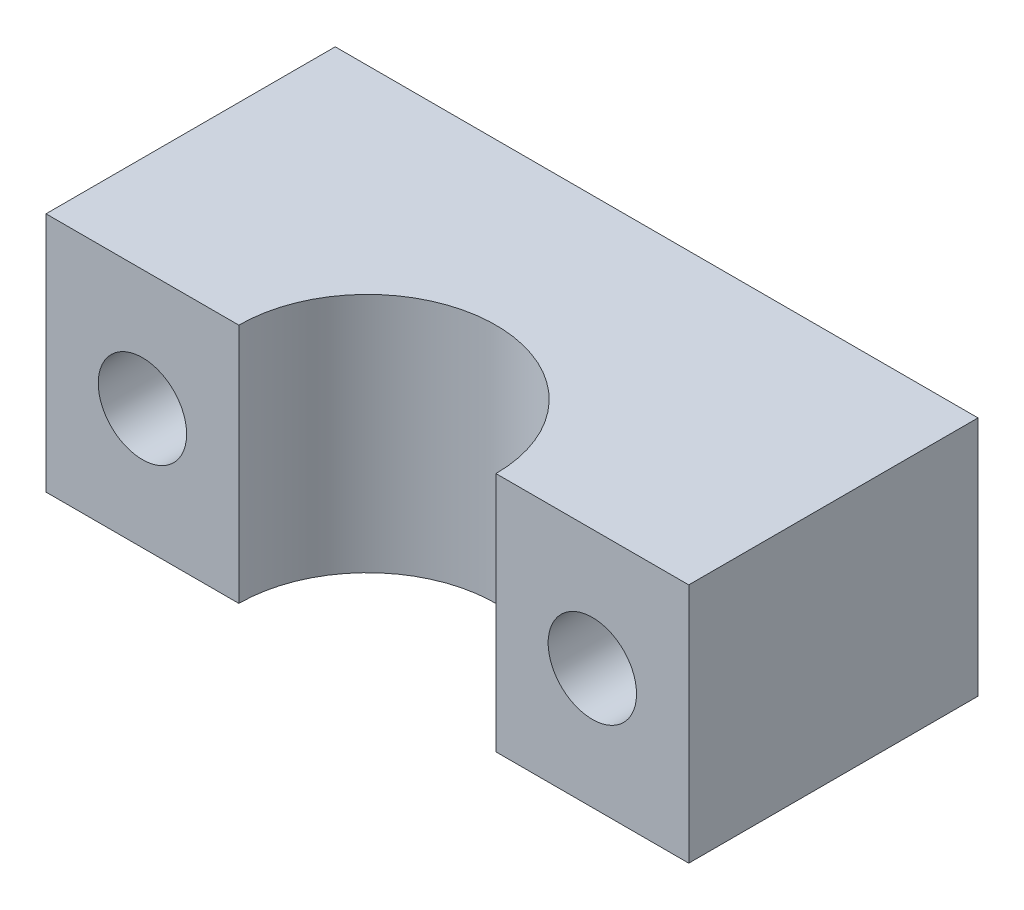
ISO-10303-21;
HEADER;
FILE_DESCRIPTION(('STEP AP214'),'2;1');
FILE_NAME('part.step','',(''),(''),'','','');
FILE_SCHEMA(('AUTOMOTIVE_DESIGN { 1 0 10303 214 1 1 1 1 }'));
ENDSEC;
DATA;
#1=APPLICATION_CONTEXT('core data for automotive mechanical design processes');
#2=APPLICATION_PROTOCOL_DEFINITION('international standard','automotive_design',2000,#1);
#3=PRODUCT_CONTEXT('',#1,'mechanical');
#4=PRODUCT('Part','Part','',(#3));
#5=PRODUCT_RELATED_PRODUCT_CATEGORY('part','',(#4));
#6=PRODUCT_DEFINITION_FORMATION('','',#4);
#7=PRODUCT_DEFINITION_CONTEXT('part definition',#1,'design');
#8=PRODUCT_DEFINITION('design','',#6,#7);
#9=PRODUCT_DEFINITION_SHAPE('','',#8);
#10=(LENGTH_UNIT() NAMED_UNIT(*) SI_UNIT(.MILLI.,.METRE.));
#11=(NAMED_UNIT(*) PLANE_ANGLE_UNIT() SI_UNIT($,.RADIAN.));
#12=(NAMED_UNIT(*) SI_UNIT($,.STERADIAN.) SOLID_ANGLE_UNIT());
#13=UNCERTAINTY_MEASURE_WITH_UNIT(LENGTH_MEASURE(1.E-05),#10,'distance_accuracy_value','');
#14=(GEOMETRIC_REPRESENTATION_CONTEXT(3) GLOBAL_UNCERTAINTY_ASSIGNED_CONTEXT((#13)) GLOBAL_UNIT_ASSIGNED_CONTEXT((#10,
#11,#12)) REPRESENTATION_CONTEXT('',''));
#15=CARTESIAN_POINT('',(0.,0.,0.));
#16=DIRECTION('',(0.,0.,1.));
#17=DIRECTION('',(1.,0.,0.));
#18=AXIS2_PLACEMENT_3D('',#15,#16,#17);
#19=CARTESIAN_POINT('',(0.,0.,18.));
#20=DIRECTION('',(0.,0.,1.));
#21=DIRECTION('',(1.,0.,0.));
#22=AXIS2_PLACEMENT_3D('',#19,#20,#21);
#23=PLANE('',#22);
#24=CARTESIAN_POINT('',(34.,-7.5,18.));
#25=DIRECTION('',(0.,0.,1.));
#26=DIRECTION('',(1.,0.,0.));
#27=AXIS2_PLACEMENT_3D('',#24,#25,#26);
#28=CIRCLE('',#27,2.75);
#29=CARTESIAN_POINT('',(36.75,-7.5,18.));
#30=VERTEX_POINT('',#29);
#31=EDGE_CURVE('E145',#30,#30,#28,.T.);
#32=ORIENTED_EDGE('',*,*,#31,.F.);
#33=EDGE_LOOP('',(#32));
#34=FACE_BOUND('',#33,.T.);
#35=DIRECTION('',(0.,1.,0.));
#36=VECTOR('',#35,1.);
#37=CARTESIAN_POINT('',(28.,-15.,18.));
#38=LINE('',#37,#36);
#39=CARTESIAN_POINT('',(28.,-15.,18.));
#40=VERTEX_POINT('',#39);
#41=CARTESIAN_POINT('',(28.,0.,18.));
#42=VERTEX_POINT('',#41);
#43=EDGE_CURVE('E11',#40,#42,#38,.T.);
#44=ORIENTED_EDGE('',*,*,#43,.F.);
#45=DIRECTION('',(1.,0.,0.));
#46=VECTOR('',#45,1.);
#47=CARTESIAN_POINT('',(0.,-15.,18.));
#48=LINE('',#47,#46);
#49=CARTESIAN_POINT('',(40.,-15.,18.));
#50=VERTEX_POINT('',#49);
#51=EDGE_CURVE('E132',#40,#50,#48,.T.);
#52=ORIENTED_EDGE('',*,*,#51,.T.);
#53=DIRECTION('',(0.,1.,0.));
#54=VECTOR('',#53,1.);
#55=CARTESIAN_POINT('',(40.,0.,18.));
#56=LINE('',#55,#54);
#57=CARTESIAN_POINT('',(40.,0.,18.));
#58=VERTEX_POINT('',#57);
#59=EDGE_CURVE('E107',#50,#58,#56,.T.);
#60=ORIENTED_EDGE('',*,*,#59,.T.);
#61=DIRECTION('',(-1.,0.,0.));
#62=VECTOR('',#61,1.);
#63=CARTESIAN_POINT('',(0.,0.,18.));
#64=LINE('',#63,#62);
#65=EDGE_CURVE('E103',#58,#42,#64,.T.);
#66=ORIENTED_EDGE('',*,*,#65,.T.);
#67=EDGE_LOOP('',(#44,#52,#60,#66));
#68=FACE_BOUND('',#67,.T.);
#69=ADVANCED_FACE('F35',(#34,#68),#23,.T.);
#70=CARTESIAN_POINT('',(0.,0.,18.));
#71=DIRECTION('',(1.,0.,0.));
#72=DIRECTION('',(0.,0.,-1.));
#73=AXIS2_PLACEMENT_3D('',#70,#71,#72);
#74=PLANE('',#73);
#75=DIRECTION('',(0.,-1.,0.));
#76=VECTOR('',#75,1.);
#77=CARTESIAN_POINT('',(0.,0.,0.));
#78=LINE('',#77,#76);
#79=CARTESIAN_POINT('',(0.,0.,0.));
#80=VERTEX_POINT('',#79);
#81=CARTESIAN_POINT('',(0.,-15.,0.));
#82=VERTEX_POINT('',#81);
#83=EDGE_CURVE('E116',#80,#82,#78,.T.);
#84=ORIENTED_EDGE('',*,*,#83,.T.);
#85=DIRECTION('',(0.,0.,-1.));
#86=VECTOR('',#85,1.);
#87=CARTESIAN_POINT('',(0.,-15.,18.));
#88=LINE('',#87,#86);
#89=CARTESIAN_POINT('',(0.,-15.,18.));
#90=VERTEX_POINT('',#89);
#91=EDGE_CURVE('E129',#90,#82,#88,.T.);
#92=ORIENTED_EDGE('',*,*,#91,.F.);
#93=DIRECTION('',(0.,-1.,0.));
#94=VECTOR('',#93,1.);
#95=CARTESIAN_POINT('',(0.,0.,18.));
#96=LINE('',#95,#94);
#97=CARTESIAN_POINT('',(0.,0.,18.));
#98=VERTEX_POINT('',#97);
#99=EDGE_CURVE('E123',#98,#90,#96,.T.);
#100=ORIENTED_EDGE('',*,*,#99,.F.);
#101=DIRECTION('',(0.,0.,-1.));
#102=VECTOR('',#101,1.);
#103=CARTESIAN_POINT('',(0.,0.,18.));
#104=LINE('',#103,#102);
#105=EDGE_CURVE('E109',#98,#80,#104,.T.);
#106=ORIENTED_EDGE('',*,*,#105,.T.);
#107=EDGE_LOOP('',(#84,#92,#100,#106));
#108=FACE_BOUND('',#107,.T.);
#109=ADVANCED_FACE('F37',(#108),#74,.F.);
#110=CARTESIAN_POINT('',(0.,-15.,18.));
#111=DIRECTION('',(0.,1.,0.));
#112=DIRECTION('',(0.,0.,1.));
#113=AXIS2_PLACEMENT_3D('',#110,#111,#112);
#114=PLANE('',#113);
#115=ORIENTED_EDGE('',*,*,#51,.F.);
#116=CARTESIAN_POINT('',(20.,-15.,18.));
#117=DIRECTION('',(0.,1.,0.));
#118=DIRECTION('',(0.,0.,1.));
#119=AXIS2_PLACEMENT_3D('',#116,#117,#118);
#120=CIRCLE('',#119,8.);
#121=CARTESIAN_POINT('',(12.,-15.,18.));
#122=VERTEX_POINT('',#121);
#123=EDGE_CURVE('E97',#40,#122,#120,.T.);
#124=ORIENTED_EDGE('',*,*,#123,.T.);
#125=EDGE_CURVE('E87',#90,#122,#48,.T.);
#126=ORIENTED_EDGE('',*,*,#125,.F.);
#127=ORIENTED_EDGE('',*,*,#91,.T.);
#128=DIRECTION('',(1.,0.,0.));
#129=VECTOR('',#128,1.);
#130=CARTESIAN_POINT('',(0.,-15.,0.));
#131=LINE('',#130,#129);
#132=CARTESIAN_POINT('',(40.,-15.,0.));
#133=VERTEX_POINT('',#132);
#134=EDGE_CURVE('E119',#82,#133,#131,.T.);
#135=ORIENTED_EDGE('',*,*,#134,.T.);
#136=DIRECTION('',(0.,0.,-1.));
#137=VECTOR('',#136,1.);
#138=CARTESIAN_POINT('',(40.,-15.,18.));
#139=LINE('',#138,#137);
#140=EDGE_CURVE('E126',#50,#133,#139,.T.);
#141=ORIENTED_EDGE('',*,*,#140,.F.);
#142=EDGE_LOOP('',(#115,#124,#126,#127,#135,#141));
#143=FACE_BOUND('',#142,.T.);
#144=ADVANCED_FACE('F130',(#143),#114,.F.);
#145=CARTESIAN_POINT('',(40.,0.,18.));
#146=DIRECTION('',(-1.,0.,0.));
#147=DIRECTION('',(0.,0.,1.));
#148=AXIS2_PLACEMENT_3D('',#145,#146,#147);
#149=PLANE('',#148);
#150=DIRECTION('',(0.,1.,0.));
#151=VECTOR('',#150,1.);
#152=CARTESIAN_POINT('',(40.,0.,0.));
#153=LINE('',#152,#151);
#154=CARTESIAN_POINT('',(40.,0.,0.));
#155=VERTEX_POINT('',#154);
#156=EDGE_CURVE('E121',#133,#155,#153,.T.);
#157=ORIENTED_EDGE('',*,*,#156,.T.);
#158=DIRECTION('',(0.,0.,-1.));
#159=VECTOR('',#158,1.);
#160=CARTESIAN_POINT('',(40.,0.,18.));
#161=LINE('',#160,#159);
#162=EDGE_CURVE('E111',#58,#155,#161,.T.);
#163=ORIENTED_EDGE('',*,*,#162,.F.);
#164=ORIENTED_EDGE('',*,*,#59,.F.);
#165=ORIENTED_EDGE('',*,*,#140,.T.);
#166=EDGE_LOOP('',(#157,#163,#164,#165));
#167=FACE_BOUND('',#166,.T.);
#168=ADVANCED_FACE('F175',(#167),#149,.F.);
#169=CARTESIAN_POINT('',(0.,0.,18.));
#170=DIRECTION('',(0.,-1.,0.));
#171=DIRECTION('',(0.,0.,-1.));
#172=AXIS2_PLACEMENT_3D('',#169,#170,#171);
#173=PLANE('',#172);
#174=CARTESIAN_POINT('',(12.,0.,18.));
#175=VERTEX_POINT('',#174);
#176=EDGE_CURVE('E57',#175,#98,#64,.T.);
#177=ORIENTED_EDGE('',*,*,#176,.F.);
#178=CARTESIAN_POINT('',(20.,0.,18.));
#179=DIRECTION('',(0.,1.,0.));
#180=DIRECTION('',(0.,0.,1.));
#181=AXIS2_PLACEMENT_3D('',#178,#179,#180);
#182=CIRCLE('',#181,8.);
#183=EDGE_CURVE('E49',#42,#175,#182,.T.);
#184=ORIENTED_EDGE('',*,*,#183,.F.);
#185=ORIENTED_EDGE('',*,*,#65,.F.);
#186=ORIENTED_EDGE('',*,*,#162,.T.);
#187=DIRECTION('',(-1.,0.,0.));
#188=VECTOR('',#187,1.);
#189=CARTESIAN_POINT('',(0.,0.,0.));
#190=LINE('',#189,#188);
#191=EDGE_CURVE('E79',#155,#80,#190,.T.);
#192=ORIENTED_EDGE('',*,*,#191,.T.);
#193=ORIENTED_EDGE('',*,*,#105,.F.);
#194=EDGE_LOOP('',(#177,#184,#185,#186,#192,#193));
#195=FACE_BOUND('',#194,.T.);
#196=ADVANCED_FACE('F102',(#195),#173,.F.);
#197=CARTESIAN_POINT('',(6.,-7.5,18.));
#198=DIRECTION('',(0.,0.,1.));
#199=DIRECTION('',(1.,0.,0.));
#200=AXIS2_PLACEMENT_3D('',#197,#198,#199);
#201=CIRCLE('',#200,2.75);
#202=CARTESIAN_POINT('',(8.75,-7.5,18.));
#203=VERTEX_POINT('',#202);
#204=EDGE_CURVE('E139',#203,#203,#201,.T.);
#205=ORIENTED_EDGE('',*,*,#204,.F.);
#206=EDGE_LOOP('',(#205));
#207=FACE_BOUND('',#206,.T.);
#208=DIRECTION('',(0.,1.,0.));
#209=VECTOR('',#208,1.);
#210=CARTESIAN_POINT('',(12.,-15.,18.));
#211=LINE('',#210,#209);
#212=EDGE_CURVE('E43',#175,#122,#211,.F.);
#213=ORIENTED_EDGE('',*,*,#212,.F.);
#214=ORIENTED_EDGE('',*,*,#176,.T.);
#215=ORIENTED_EDGE('',*,*,#99,.T.);
#216=ORIENTED_EDGE('',*,*,#125,.T.);
#217=EDGE_LOOP('',(#213,#214,#215,#216));
#218=FACE_BOUND('',#217,.T.);
#219=ADVANCED_FACE('F134',(#207,#218),#23,.T.);
#220=CARTESIAN_POINT('',(0.,0.,0.));
#221=DIRECTION('',(0.,0.,1.));
#222=DIRECTION('',(1.,0.,0.));
#223=AXIS2_PLACEMENT_3D('',#220,#221,#222);
#224=PLANE('',#223);
#225=CARTESIAN_POINT('',(34.,-7.5,0.));
#226=DIRECTION('',(0.,0.,1.));
#227=DIRECTION('',(1.,0.,0.));
#228=AXIS2_PLACEMENT_3D('',#225,#226,#227);
#229=CIRCLE('',#228,2.75);
#230=CARTESIAN_POINT('',(36.75,-7.5,0.));
#231=VERTEX_POINT('',#230);
#232=EDGE_CURVE('E104',#231,#231,#229,.T.);
#233=ORIENTED_EDGE('',*,*,#232,.T.);
#234=EDGE_LOOP('',(#233));
#235=FACE_BOUND('',#234,.T.);
#236=CARTESIAN_POINT('',(6.,-7.5,0.));
#237=DIRECTION('',(0.,0.,1.));
#238=DIRECTION('',(1.,0.,0.));
#239=AXIS2_PLACEMENT_3D('',#236,#237,#238);
#240=CIRCLE('',#239,2.75);
#241=CARTESIAN_POINT('',(8.75,-7.5,0.));
#242=VERTEX_POINT('',#241);
#243=EDGE_CURVE('E142',#242,#242,#240,.T.);
#244=ORIENTED_EDGE('',*,*,#243,.T.);
#245=EDGE_LOOP('',(#244));
#246=FACE_BOUND('',#245,.T.);
#247=ORIENTED_EDGE('',*,*,#83,.F.);
#248=ORIENTED_EDGE('',*,*,#191,.F.);
#249=ORIENTED_EDGE('',*,*,#156,.F.);
#250=ORIENTED_EDGE('',*,*,#134,.F.);
#251=EDGE_LOOP('',(#247,#248,#249,#250));
#252=FACE_BOUND('',#251,.T.);
#253=ADVANCED_FACE('F151',(#235,#246,#252),#224,.F.);
#254=CARTESIAN_POINT('',(20.,-15.,18.));
#255=DIRECTION('',(0.,1.,0.));
#256=DIRECTION('',(0.,0.,1.));
#257=AXIS2_PLACEMENT_3D('',#254,#255,#256);
#258=CYLINDRICAL_SURFACE('',#257,8.);
#259=ORIENTED_EDGE('',*,*,#43,.T.);
#260=ORIENTED_EDGE('',*,*,#183,.T.);
#261=ORIENTED_EDGE('',*,*,#212,.T.);
#262=ORIENTED_EDGE('',*,*,#123,.F.);
#263=EDGE_LOOP('',(#259,#260,#261,#262));
#264=FACE_BOUND('',#263,.T.);
#265=ADVANCED_FACE('F96',(#264),#258,.F.);
#266=CARTESIAN_POINT('',(6.,-7.5,0.));
#267=DIRECTION('',(0.,0.,1.));
#268=DIRECTION('',(1.,0.,0.));
#269=AXIS2_PLACEMENT_3D('',#266,#267,#268);
#270=CYLINDRICAL_SURFACE('',#269,2.75);
#271=ORIENTED_EDGE('',*,*,#243,.F.);
#272=EDGE_LOOP('',(#271));
#273=FACE_BOUND('',#272,.T.);
#274=ORIENTED_EDGE('',*,*,#204,.T.);
#275=EDGE_LOOP('',(#274));
#276=FACE_BOUND('',#275,.T.);
#277=ADVANCED_FACE('F157',(#273,#276),#270,.F.);
#278=CARTESIAN_POINT('',(34.,-7.5,0.));
#279=DIRECTION('',(0.,0.,1.));
#280=DIRECTION('',(1.,0.,0.));
#281=AXIS2_PLACEMENT_3D('',#278,#279,#280);
#282=CYLINDRICAL_SURFACE('',#281,2.75);
#283=ORIENTED_EDGE('',*,*,#232,.F.);
#284=EDGE_LOOP('',(#283));
#285=FACE_BOUND('',#284,.T.);
#286=ORIENTED_EDGE('',*,*,#31,.T.);
#287=EDGE_LOOP('',(#286));
#288=FACE_BOUND('',#287,.T.);
#289=ADVANCED_FACE('F154',(#285,#288),#282,.F.);
#290=CLOSED_SHELL('',(#69,#109,#144,#168,#196,#219,#253,#265,#277,#289));
#291=MANIFOLD_SOLID_BREP('B2',#290);
#292=ADVANCED_BREP_SHAPE_REPRESENTATION('',(#18,#291),#14);
#293=SHAPE_DEFINITION_REPRESENTATION(#9,#292);
ENDSEC;
END-ISO-10303-21;
